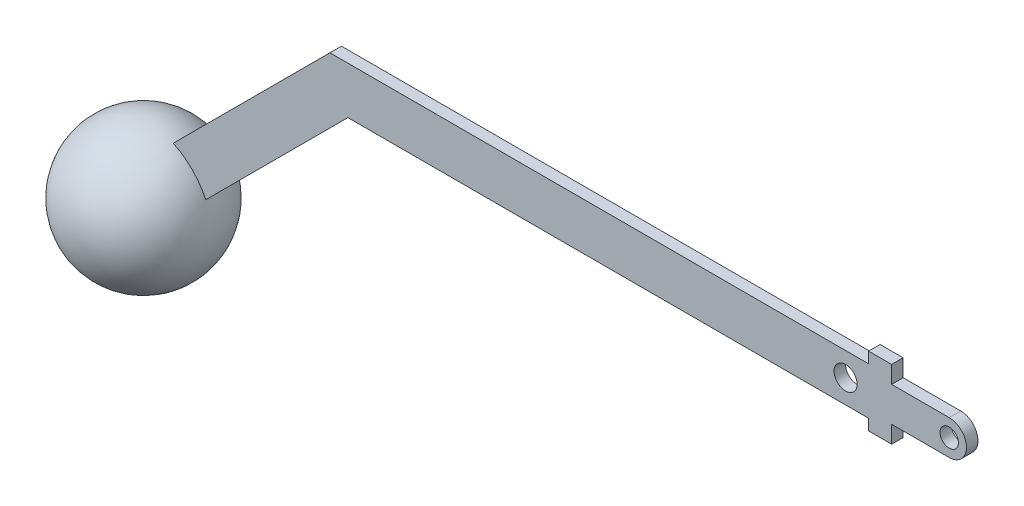
ISO-10303-21;
HEADER;
FILE_DESCRIPTION(('STEP AP214'),'2;1');
FILE_NAME('part.step','',(''),(''),'','','');
FILE_SCHEMA(('AUTOMOTIVE_DESIGN { 1 0 10303 214 1 1 1 1 }'));
ENDSEC;
DATA;
#1=APPLICATION_CONTEXT('core data for automotive mechanical design processes');
#2=APPLICATION_PROTOCOL_DEFINITION('international standard','automotive_design',2000,#1);
#3=PRODUCT_CONTEXT('',#1,'mechanical');
#4=PRODUCT('Part','Part','',(#3));
#5=PRODUCT_RELATED_PRODUCT_CATEGORY('part','',(#4));
#6=PRODUCT_DEFINITION_FORMATION('','',#4);
#7=PRODUCT_DEFINITION_CONTEXT('part definition',#1,'design');
#8=PRODUCT_DEFINITION('design','',#6,#7);
#9=PRODUCT_DEFINITION_SHAPE('','',#8);
#10=(LENGTH_UNIT() NAMED_UNIT(*) SI_UNIT(.MILLI.,.METRE.));
#11=(NAMED_UNIT(*) PLANE_ANGLE_UNIT() SI_UNIT($,.RADIAN.));
#12=(NAMED_UNIT(*) SI_UNIT($,.STERADIAN.) SOLID_ANGLE_UNIT());
#13=UNCERTAINTY_MEASURE_WITH_UNIT(LENGTH_MEASURE(1.E-05),#10,'distance_accuracy_value','');
#14=(GEOMETRIC_REPRESENTATION_CONTEXT(3) GLOBAL_UNCERTAINTY_ASSIGNED_CONTEXT((#13)) GLOBAL_UNIT_ASSIGNED_CONTEXT((#10,
#11,#12)) REPRESENTATION_CONTEXT('',''));
#15=CARTESIAN_POINT('',(0.,0.,0.));
#16=DIRECTION('',(0.,0.,1.));
#17=DIRECTION('',(1.,0.,0.));
#18=AXIS2_PLACEMENT_3D('',#15,#16,#17);
#19=CARTESIAN_POINT('',(-18.8288741067103,0.,0.));
#20=DIRECTION('',(1.,0.,0.));
#21=DIRECTION('',(0.,0.,-1.));
#22=AXIS2_PLACEMENT_3D('',#19,#20,#21);
#23=PLANE('',#22);
#24=DIRECTION('',(0.,0.,1.));
#25=VECTOR('',#24,1.);
#26=CARTESIAN_POINT('',(-18.8288741067103,7.5,4.99999999999999));
#27=LINE('',#26,#25);
#28=CARTESIAN_POINT('',(-18.8288741067103,7.5,0.));
#29=VERTEX_POINT('',#28);
#30=CARTESIAN_POINT('',(-18.8288741067103,7.5,4.99999999999999));
#31=VERTEX_POINT('',#30);
#32=EDGE_CURVE('E247',#29,#31,#27,.T.);
#33=ORIENTED_EDGE('',*,*,#32,.F.);
#34=DIRECTION('',(0.,1.,0.));
#35=VECTOR('',#34,1.);
#36=CARTESIAN_POINT('',(-18.8288741067103,15.,0.));
#37=LINE('',#36,#35);
#38=CARTESIAN_POINT('',(-18.8288741067103,15.,0.));
#39=VERTEX_POINT('',#38);
#40=EDGE_CURVE('E167',#29,#39,#37,.T.);
#41=ORIENTED_EDGE('',*,*,#40,.T.);
#42=DIRECTION('',(0.,0.,1.));
#43=VECTOR('',#42,1.);
#44=CARTESIAN_POINT('',(-18.8288741067103,15.,4.99999999999999));
#45=LINE('',#44,#43);
#46=CARTESIAN_POINT('',(-18.8288741067103,15.,4.99999999999999));
#47=VERTEX_POINT('',#46);
#48=EDGE_CURVE('E171',#39,#47,#45,.T.);
#49=ORIENTED_EDGE('',*,*,#48,.T.);
#50=DIRECTION('',(0.,-1.,0.));
#51=VECTOR('',#50,1.);
#52=CARTESIAN_POINT('',(-18.8288741067103,15.,4.99999999999999));
#53=LINE('',#52,#51);
#54=EDGE_CURVE('E162',#47,#31,#53,.T.);
#55=ORIENTED_EDGE('',*,*,#54,.T.);
#56=EDGE_LOOP('',(#33,#41,#49,#55));
#57=FACE_BOUND('',#56,.T.);
#58=ADVANCED_FACE('F35',(#57),#23,.T.);
#59=CARTESIAN_POINT('',(29.1954306267144,-10.2348441813063,5.));
#60=DIRECTION('',(0.,1.,0.));
#61=DIRECTION('',(0.,0.,1.));
#62=AXIS2_PLACEMENT_3D('',#59,#60,#61);
#63=PLANE('',#62);
#64=DIRECTION('',(1.,0.,0.));
#65=VECTOR('',#64,1.);
#66=CARTESIAN_POINT('',(29.1954306267144,-10.2348441813063,0.));
#67=LINE('',#66,#65);
#68=CARTESIAN_POINT('',(-254.897277930861,-10.2348441813064,0.));
#69=VERTEX_POINT('',#68);
#70=CARTESIAN_POINT('',(-28.8288741067103,-10.2348441813063,0.));
#71=VERTEX_POINT('',#70);
#72=EDGE_CURVE('E233',#69,#71,#67,.T.);
#73=ORIENTED_EDGE('',*,*,#72,.T.);
#74=DIRECTION('',(0.,0.,1.));
#75=VECTOR('',#74,1.);
#76=CARTESIAN_POINT('',(-28.8288741067103,-10.2348441813063,5.));
#77=LINE('',#76,#75);
#78=CARTESIAN_POINT('',(-28.8288741067103,-10.2348441813063,5.));
#79=VERTEX_POINT('',#78);
#80=EDGE_CURVE('E196',#71,#79,#77,.T.);
#81=ORIENTED_EDGE('',*,*,#80,.T.);
#82=DIRECTION('',(1.,0.,0.));
#83=VECTOR('',#82,1.);
#84=CARTESIAN_POINT('',(-260.804569373286,-10.2348441813063,5.));
#85=LINE('',#84,#83);
#86=CARTESIAN_POINT('',(-254.897277930861,-10.2348441813063,5.));
#87=VERTEX_POINT('',#86);
#88=EDGE_CURVE('E229',#87,#79,#85,.T.);
#89=ORIENTED_EDGE('',*,*,#88,.F.);
#90=DIRECTION('',(0.,0.,1.));
#91=VECTOR('',#90,1.);
#92=CARTESIAN_POINT('',(-254.897277930861,-10.2348441813063,-140.071478045431));
#93=LINE('',#92,#91);
#94=EDGE_CURVE('E219',#69,#87,#93,.T.);
#95=ORIENTED_EDGE('',*,*,#94,.F.);
#96=EDGE_LOOP('',(#73,#81,#89,#95));
#97=FACE_BOUND('',#96,.T.);
#98=ADVANCED_FACE('F37',(#97),#63,.F.);
#99=CARTESIAN_POINT('',(-52.6472735149724,10.2348441813063,5.));
#100=DIRECTION('',(0.,-1.,0.));
#101=DIRECTION('',(1.,0.,0.));
#102=AXIS2_PLACEMENT_3D('',#99,#100,#101);
#103=PLANE('',#102);
#104=DIRECTION('',(-1.,0.,0.));
#105=VECTOR('',#104,1.);
#106=CARTESIAN_POINT('',(-138.115348744524,10.2348441813063,5.));
#107=LINE('',#106,#105);
#108=CARTESIAN_POINT('',(-28.8288741067103,10.2348441813063,4.99999999999999));
#109=VERTEX_POINT('',#108);
#110=CARTESIAN_POINT('',(-262.71186081571,10.2348441813063,5.));
#111=VERTEX_POINT('',#110);
#112=EDGE_CURVE('E227',#109,#111,#107,.T.);
#113=ORIENTED_EDGE('',*,*,#112,.F.);
#114=DIRECTION('',(0.,0.,1.));
#115=VECTOR('',#114,1.);
#116=CARTESIAN_POINT('',(-28.8288741067103,10.2348441813063,-44.5));
#117=LINE('',#116,#115);
#118=CARTESIAN_POINT('',(-28.8288741067103,10.2348441813063,0.));
#119=VERTEX_POINT('',#118);
#120=EDGE_CURVE('E194',#119,#109,#117,.T.);
#121=ORIENTED_EDGE('',*,*,#120,.F.);
#122=DIRECTION('',(-1.,0.,0.));
#123=VECTOR('',#122,1.);
#124=CARTESIAN_POINT('',(-52.6472735149724,10.2348441813063,0.));
#125=LINE('',#124,#123);
#126=CARTESIAN_POINT('',(-262.71186081571,10.2348441813063,0.));
#127=VERTEX_POINT('',#126);
#128=EDGE_CURVE('E230',#119,#127,#125,.T.);
#129=ORIENTED_EDGE('',*,*,#128,.T.);
#130=DIRECTION('',(0.,0.,1.));
#131=VECTOR('',#130,1.);
#132=CARTESIAN_POINT('',(-262.71186081571,10.2348441813063,-140.071478045431));
#133=LINE('',#132,#131);
#134=EDGE_CURVE('E212',#127,#111,#133,.T.);
#135=ORIENTED_EDGE('',*,*,#134,.T.);
#136=EDGE_LOOP('',(#113,#121,#129,#135));
#137=FACE_BOUND('',#136,.T.);
#138=ADVANCED_FACE('F281',(#137),#103,.F.);
#139=CARTESIAN_POINT('',(29.1954306267144,0.,5.));
#140=DIRECTION('',(0.,0.,1.));
#141=DIRECTION('',(1.,0.,0.));
#142=AXIS2_PLACEMENT_3D('',#139,#140,#141);
#143=PLANE('',#142);
#144=CARTESIAN_POINT('',(6.17112589328973,0.,5.));
#145=DIRECTION('',(0.,0.,-1.));
#146=DIRECTION('',(1.,0.,0.));
#147=AXIS2_PLACEMENT_3D('',#144,#145,#146);
#148=CIRCLE('',#147,7.5);
#149=CARTESIAN_POINT('',(6.17112589328973,7.5,5.));
#150=VERTEX_POINT('',#149);
#151=CARTESIAN_POINT('',(6.17112589328973,-7.5,5.));
#152=VERTEX_POINT('',#151);
#153=EDGE_CURVE('E134',#150,#152,#148,.T.);
#154=ORIENTED_EDGE('',*,*,#153,.F.);
#155=DIRECTION('',(-1.,0.,0.));
#156=VECTOR('',#155,1.);
#157=CARTESIAN_POINT('',(41.1711258932897,7.5,4.99999999999999));
#158=LINE('',#157,#156);
#159=EDGE_CURVE('E256',#150,#31,#158,.T.);
#160=ORIENTED_EDGE('',*,*,#159,.T.);
#161=ORIENTED_EDGE('',*,*,#54,.F.);
#162=DIRECTION('',(-1.,0.,0.));
#163=VECTOR('',#162,1.);
#164=CARTESIAN_POINT('',(-18.8288741067103,15.,4.99999999999999));
#165=LINE('',#164,#163);
#166=CARTESIAN_POINT('',(-28.8288741067103,15.,4.99999999999999));
#167=VERTEX_POINT('',#166);
#168=EDGE_CURVE('E172',#47,#167,#165,.T.);
#169=ORIENTED_EDGE('',*,*,#168,.T.);
#170=DIRECTION('',(0.,-1.,0.));
#171=VECTOR('',#170,1.);
#172=CARTESIAN_POINT('',(-28.8288741067103,15.,4.99999999999999));
#173=LINE('',#172,#171);
#174=EDGE_CURVE('E157',#167,#109,#173,.T.);
#175=ORIENTED_EDGE('',*,*,#174,.T.);
#176=ORIENTED_EDGE('',*,*,#112,.T.);
#177=DIRECTION('',(-0.707106781186551,-0.707106781186544,0.));
#178=VECTOR('',#177,1.);
#179=CARTESIAN_POINT('',(-350.728450927537,-77.7817459305198,5.));
#180=LINE('',#179,#178);
#181=CARTESIAN_POINT('',(-330.728450927537,-57.7817459305198,5.));
#182=VERTEX_POINT('',#181);
#183=EDGE_CURVE('E216',#111,#182,#180,.T.);
#184=ORIENTED_EDGE('',*,*,#183,.T.);
#185=CARTESIAN_POINT('',(-343.657383115672,-84.8528137423853,5.));
#186=DIRECTION('',(0.,0.,1.));
#187=DIRECTION('',(1.,0.,0.));
#188=AXIS2_PLACEMENT_3D('',#185,#186,#187);
#189=CIRCLE('',#188,30.);
#190=CARTESIAN_POINT('',(-316.586315303806,-71.9238815542509,5.));
#191=VERTEX_POINT('',#190);
#192=EDGE_CURVE('E201',#182,#191,#189,.F.);
#193=ORIENTED_EDGE('',*,*,#192,.T.);
#194=DIRECTION('',(0.707106781186551,0.707106781186544,0.));
#195=VECTOR('',#194,1.);
#196=CARTESIAN_POINT('',(-336.586315303806,-91.9238815542507,5.));
#197=LINE('',#196,#195);
#198=EDGE_CURVE('E207',#191,#87,#197,.T.);
#199=ORIENTED_EDGE('',*,*,#198,.T.);
#200=ORIENTED_EDGE('',*,*,#88,.T.);
#201=CARTESIAN_POINT('',(-28.8288741067103,-15.,4.99999999999999));
#202=VERTEX_POINT('',#201);
#203=EDGE_CURVE('E155',#79,#202,#173,.T.);
#204=ORIENTED_EDGE('',*,*,#203,.T.);
#205=DIRECTION('',(-1.,0.,0.));
#206=VECTOR('',#205,1.);
#207=CARTESIAN_POINT('',(-18.8288741067103,-15.,4.99999999999999));
#208=LINE('',#207,#206);
#209=CARTESIAN_POINT('',(-18.8288741067103,-15.,4.99999999999999));
#210=VERTEX_POINT('',#209);
#211=EDGE_CURVE('E191',#210,#202,#208,.T.);
#212=ORIENTED_EDGE('',*,*,#211,.F.);
#213=CARTESIAN_POINT('',(-18.8288741067103,-7.5,4.99999999999999));
#214=VERTEX_POINT('',#213);
#215=EDGE_CURVE('E154',#214,#210,#53,.T.);
#216=ORIENTED_EDGE('',*,*,#215,.F.);
#217=DIRECTION('',(-1.,0.,0.));
#218=VECTOR('',#217,1.);
#219=CARTESIAN_POINT('',(41.1711258932897,-7.5,4.99999999999998));
#220=LINE('',#219,#218);
#221=EDGE_CURVE('E146',#152,#214,#220,.T.);
#222=ORIENTED_EDGE('',*,*,#221,.F.);
#223=EDGE_LOOP('',(#154,#160,#161,#169,#175,#176,#184,#193,#199,#200,#204,#212,#216,#222));
#224=FACE_BOUND('',#223,.T.);
#225=CARTESIAN_POINT('',(6.17112589328973,0.,5.));
#226=DIRECTION('',(0.,0.,1.));
#227=DIRECTION('',(1.,0.,0.));
#228=AXIS2_PLACEMENT_3D('',#225,#226,#227);
#229=CIRCLE('',#228,4.);
#230=CARTESIAN_POINT('',(10.1711258932897,0.,5.));
#231=VERTEX_POINT('',#230);
#232=EDGE_CURVE('E244',#231,#231,#229,.T.);
#233=ORIENTED_EDGE('',*,*,#232,.F.);
#234=EDGE_LOOP('',(#233));
#235=FACE_BOUND('',#234,.T.);
#236=CARTESIAN_POINT('',(-38.8288741067103,0.,5.));
#237=DIRECTION('',(0.,0.,1.));
#238=DIRECTION('',(1.,0.,0.));
#239=AXIS2_PLACEMENT_3D('',#236,#237,#238);
#240=CIRCLE('',#239,5.);
#241=CARTESIAN_POINT('',(-33.8288741067103,0.,5.));
#242=VERTEX_POINT('',#241);
#243=EDGE_CURVE('E214',#242,#242,#240,.T.);
#244=ORIENTED_EDGE('',*,*,#243,.F.);
#245=EDGE_LOOP('',(#244));
#246=FACE_BOUND('',#245,.T.);
#247=ADVANCED_FACE('F151',(#224,#235,#246),#143,.T.);
#248=CARTESIAN_POINT('',(29.1954306267144,0.,0.));
#249=DIRECTION('',(0.,0.,1.));
#250=DIRECTION('',(1.,0.,0.));
#251=AXIS2_PLACEMENT_3D('',#248,#249,#250);
#252=PLANE('',#251);
#253=CARTESIAN_POINT('',(6.17112589328973,0.,0.));
#254=DIRECTION('',(0.,0.,1.));
#255=DIRECTION('',(1.,0.,0.));
#256=AXIS2_PLACEMENT_3D('',#253,#254,#255);
#257=CIRCLE('',#256,4.);
#258=CARTESIAN_POINT('',(10.1711258932897,0.,0.));
#259=VERTEX_POINT('',#258);
#260=EDGE_CURVE('E241',#259,#259,#257,.T.);
#261=ORIENTED_EDGE('',*,*,#260,.T.);
#262=EDGE_LOOP('',(#261));
#263=FACE_BOUND('',#262,.T.);
#264=DIRECTION('',(-1.,0.,0.));
#265=VECTOR('',#264,1.);
#266=CARTESIAN_POINT('',(41.1711258932897,7.5,0.));
#267=LINE('',#266,#265);
#268=CARTESIAN_POINT('',(6.17112589328973,7.5,0.));
#269=VERTEX_POINT('',#268);
#270=EDGE_CURVE('E56',#269,#29,#267,.T.);
#271=ORIENTED_EDGE('',*,*,#270,.F.);
#272=CARTESIAN_POINT('',(6.17112589328973,0.,0.));
#273=DIRECTION('',(0.,0.,1.));
#274=DIRECTION('',(1.,0.,0.));
#275=AXIS2_PLACEMENT_3D('',#272,#273,#274);
#276=CIRCLE('',#275,7.5);
#277=CARTESIAN_POINT('',(6.17112589328973,-7.5,0.));
#278=VERTEX_POINT('',#277);
#279=EDGE_CURVE('E50',#269,#278,#276,.F.);
#280=ORIENTED_EDGE('',*,*,#279,.T.);
#281=DIRECTION('',(-1.,0.,0.));
#282=VECTOR('',#281,1.);
#283=CARTESIAN_POINT('',(41.1711258932897,-7.5,0.));
#284=LINE('',#283,#282);
#285=CARTESIAN_POINT('',(-18.8288741067103,-7.5,0.));
#286=VERTEX_POINT('',#285);
#287=EDGE_CURVE('E148',#278,#286,#284,.T.);
#288=ORIENTED_EDGE('',*,*,#287,.T.);
#289=CARTESIAN_POINT('',(-18.8288741067103,-15.,0.));
#290=VERTEX_POINT('',#289);
#291=EDGE_CURVE('E168',#290,#286,#37,.T.);
#292=ORIENTED_EDGE('',*,*,#291,.F.);
#293=DIRECTION('',(-1.,0.,0.));
#294=VECTOR('',#293,1.);
#295=CARTESIAN_POINT('',(-18.8288741067103,-15.,0.));
#296=LINE('',#295,#294);
#297=CARTESIAN_POINT('',(-28.8288741067103,-15.,0.));
#298=VERTEX_POINT('',#297);
#299=EDGE_CURVE('E188',#290,#298,#296,.T.);
#300=ORIENTED_EDGE('',*,*,#299,.T.);
#301=DIRECTION('',(0.,1.,0.));
#302=VECTOR('',#301,1.);
#303=CARTESIAN_POINT('',(-28.8288741067103,15.,0.));
#304=LINE('',#303,#302);
#305=EDGE_CURVE('E178',#298,#71,#304,.T.);
#306=ORIENTED_EDGE('',*,*,#305,.T.);
#307=ORIENTED_EDGE('',*,*,#72,.F.);
#308=DIRECTION('',(-0.707106781186551,-0.707106781186544,0.));
#309=VECTOR('',#308,1.);
#310=CARTESIAN_POINT('',(-336.586315303806,-91.9238815542507,0.));
#311=LINE('',#310,#309);
#312=CARTESIAN_POINT('',(-316.901295618777,-72.2388618692214,0.));
#313=VERTEX_POINT('',#312);
#314=EDGE_CURVE('E208',#69,#313,#311,.T.);
#315=ORIENTED_EDGE('',*,*,#314,.T.);
#316=CARTESIAN_POINT('',(-343.657383115672,-84.8528137423853,0.));
#317=DIRECTION('',(0.,0.,1.));
#318=DIRECTION('',(1.,0.,0.));
#319=AXIS2_PLACEMENT_3D('',#316,#317,#318);
#320=CIRCLE('',#319,29.5803989154981);
#321=CARTESIAN_POINT('',(-331.043431242507,-58.0967262454903,0.));
#322=VERTEX_POINT('',#321);
#323=EDGE_CURVE('E199',#322,#313,#320,.F.);
#324=ORIENTED_EDGE('',*,*,#323,.F.);
#325=DIRECTION('',(0.707106781186551,0.707106781186544,0.));
#326=VECTOR('',#325,1.);
#327=CARTESIAN_POINT('',(-350.728450927537,-77.7817459305198,0.));
#328=LINE('',#327,#326);
#329=EDGE_CURVE('E211',#322,#127,#328,.T.);
#330=ORIENTED_EDGE('',*,*,#329,.T.);
#331=ORIENTED_EDGE('',*,*,#128,.F.);
#332=CARTESIAN_POINT('',(-28.8288741067103,15.,0.));
#333=VERTEX_POINT('',#332);
#334=EDGE_CURVE('E177',#119,#333,#304,.T.);
#335=ORIENTED_EDGE('',*,*,#334,.T.);
#336=DIRECTION('',(-1.,0.,0.));
#337=VECTOR('',#336,1.);
#338=CARTESIAN_POINT('',(-18.8288741067103,15.,0.));
#339=LINE('',#338,#337);
#340=EDGE_CURVE('E185',#39,#333,#339,.T.);
#341=ORIENTED_EDGE('',*,*,#340,.F.);
#342=ORIENTED_EDGE('',*,*,#40,.F.);
#343=EDGE_LOOP('',(#271,#280,#288,#292,#300,#306,#307,#315,#324,#330,#331,#335,#341,#342));
#344=FACE_BOUND('',#343,.T.);
#345=CARTESIAN_POINT('',(-38.8288741067103,0.,0.));
#346=DIRECTION('',(0.,0.,1.));
#347=DIRECTION('',(1.,0.,0.));
#348=AXIS2_PLACEMENT_3D('',#345,#346,#347);
#349=CIRCLE('',#348,5.);
#350=CARTESIAN_POINT('',(-33.8288741067103,0.,0.));
#351=VERTEX_POINT('',#350);
#352=EDGE_CURVE('E226',#351,#351,#349,.T.);
#353=ORIENTED_EDGE('',*,*,#352,.T.);
#354=EDGE_LOOP('',(#353));
#355=FACE_BOUND('',#354,.T.);
#356=ADVANCED_FACE('F300',(#263,#344,#355),#252,.F.);
#357=CARTESIAN_POINT('',(-38.8288741067103,0.,-17.5));
#358=DIRECTION('',(0.,0.,1.));
#359=DIRECTION('',(1.,0.,0.));
#360=AXIS2_PLACEMENT_3D('',#357,#358,#359);
#361=CYLINDRICAL_SURFACE('',#360,5.);
#362=CARTESIAN_POINT('',(-33.8288741067103,0.,5.));
#363=CARTESIAN_POINT('',(-33.8288741067103,0.,4.94791666666667));
#364=CARTESIAN_POINT('',(-33.8288741067103,0.,4.89583333333333));
#365=CARTESIAN_POINT('',(-33.8288741067103,0.,4.79166666666667));
#366=CARTESIAN_POINT('',(-33.8288741067103,0.,4.73958333333333));
#367=CARTESIAN_POINT('',(-33.8288741067103,0.,4.63541666666667));
#368=CARTESIAN_POINT('',(-33.8288741067103,0.,4.58333333333333));
#369=CARTESIAN_POINT('',(-33.8288741067103,0.,4.47916666666667));
#370=CARTESIAN_POINT('',(-33.8288741067103,0.,4.42708333333333));
#371=CARTESIAN_POINT('',(-33.8288741067103,0.,4.32291666666667));
#372=CARTESIAN_POINT('',(-33.8288741067103,0.,4.27083333333333));
#373=CARTESIAN_POINT('',(-33.8288741067103,0.,4.16666666666667));
#374=CARTESIAN_POINT('',(-33.8288741067103,0.,4.11458333333333));
#375=CARTESIAN_POINT('',(-33.8288741067103,0.,4.01041666666667));
#376=CARTESIAN_POINT('',(-33.8288741067103,0.,3.95833333333333));
#377=CARTESIAN_POINT('',(-33.8288741067103,0.,3.85416666666667));
#378=CARTESIAN_POINT('',(-33.8288741067103,0.,3.80208333333333));
#379=CARTESIAN_POINT('',(-33.8288741067103,0.,3.69791666666667));
#380=CARTESIAN_POINT('',(-33.8288741067103,0.,3.64583333333333));
#381=CARTESIAN_POINT('',(-33.8288741067103,0.,3.54166666666667));
#382=CARTESIAN_POINT('',(-33.8288741067103,0.,3.48958333333333));
#383=CARTESIAN_POINT('',(-33.8288741067103,0.,3.38541666666667));
#384=CARTESIAN_POINT('',(-33.8288741067103,0.,3.33333333333333));
#385=CARTESIAN_POINT('',(-33.8288741067103,0.,3.22916666666667));
#386=CARTESIAN_POINT('',(-33.8288741067103,0.,3.17708333333333));
#387=CARTESIAN_POINT('',(-33.8288741067103,0.,3.07291666666667));
#388=CARTESIAN_POINT('',(-33.8288741067103,0.,3.02083333333333));
#389=CARTESIAN_POINT('',(-33.8288741067103,0.,2.91666666666667));
#390=CARTESIAN_POINT('',(-33.8288741067103,0.,2.86458333333333));
#391=CARTESIAN_POINT('',(-33.8288741067103,0.,2.76041666666667));
#392=CARTESIAN_POINT('',(-33.8288741067103,0.,2.70833333333333));
#393=CARTESIAN_POINT('',(-33.8288741067103,0.,2.60416666666667));
#394=CARTESIAN_POINT('',(-33.8288741067103,0.,2.55208333333333));
#395=CARTESIAN_POINT('',(-33.8288741067103,0.,2.44791666666667));
#396=CARTESIAN_POINT('',(-33.8288741067103,0.,2.39583333333333));
#397=CARTESIAN_POINT('',(-33.8288741067103,0.,2.29166666666667));
#398=CARTESIAN_POINT('',(-33.8288741067103,0.,2.23958333333333));
#399=CARTESIAN_POINT('',(-33.8288741067103,0.,2.13541666666667));
#400=CARTESIAN_POINT('',(-33.8288741067103,0.,2.08333333333333));
#401=CARTESIAN_POINT('',(-33.8288741067103,0.,1.97916666666667));
#402=CARTESIAN_POINT('',(-33.8288741067103,0.,1.92708333333333));
#403=CARTESIAN_POINT('',(-33.8288741067103,0.,1.82291666666666));
#404=CARTESIAN_POINT('',(-33.8288741067103,0.,1.77083333333333));
#405=CARTESIAN_POINT('',(-33.8288741067103,0.,1.66666666666666));
#406=CARTESIAN_POINT('',(-33.8288741067103,0.,1.61458333333333));
#407=CARTESIAN_POINT('',(-33.8288741067103,0.,1.51041666666666));
#408=CARTESIAN_POINT('',(-33.8288741067103,0.,1.45833333333333));
#409=CARTESIAN_POINT('',(-33.8288741067103,0.,1.35416666666666));
#410=CARTESIAN_POINT('',(-33.8288741067103,0.,1.30208333333333));
#411=CARTESIAN_POINT('',(-33.8288741067103,0.,1.19791666666666));
#412=CARTESIAN_POINT('',(-33.8288741067103,0.,1.14583333333333));
#413=CARTESIAN_POINT('',(-33.8288741067103,0.,1.04166666666666));
#414=CARTESIAN_POINT('',(-33.8288741067103,0.,0.989583333333331));
#415=CARTESIAN_POINT('',(-33.8288741067103,0.,0.885416666666664));
#416=CARTESIAN_POINT('',(-33.8288741067103,0.,0.833333333333331));
#417=CARTESIAN_POINT('',(-33.8288741067103,0.,0.729166666666664));
#418=CARTESIAN_POINT('',(-33.8288741067103,0.,0.67708333333333));
#419=CARTESIAN_POINT('',(-33.8288741067103,0.,0.572916666666664));
#420=CARTESIAN_POINT('',(-33.8288741067103,0.,0.52083333333333));
#421=CARTESIAN_POINT('',(-33.8288741067103,0.,0.416666666666664));
#422=CARTESIAN_POINT('',(-33.8288741067103,0.,0.36458333333333));
#423=CARTESIAN_POINT('',(-33.8288741067103,0.,0.260416666666663));
#424=CARTESIAN_POINT('',(-33.8288741067103,0.,0.20833333333333));
#425=CARTESIAN_POINT('',(-33.8288741067103,0.,0.104166666666663));
#426=CARTESIAN_POINT('',(-33.8288741067103,0.,0.05208333333333));
#427=CARTESIAN_POINT('',(-33.8288741067103,0.,0.));
#428=B_SPLINE_CURVE_WITH_KNOTS('',3,(#362,#363,#364,#365,#366,#367,#368,#369,#370,#371,#372,
#373,#374,#375,#376,#377,#378,#379,#380,#381,#382,#383,#384,#385,#386,#387,#388,#389,#390,#391,
#392,#393,#394,#395,#396,#397,#398,#399,#400,#401,#402,#403,#404,#405,#406,#407,#408,#409,#410,
#411,#412,#413,#414,#415,#416,#417,#418,#419,#420,#421,#422,#423,#424,#425,#426,#427),
.UNSPECIFIED.,.F.,.F.,(4,2,2,2,2,2,2,2,2,2,2,2,2,2,2,2,2,2,2,2,2,2,2,2,2,2,2,2,2,2,2,2,4),(0.,
0.15625,0.3125,0.46875,0.625000000000001,0.781250000000001,0.937500000000001,1.09375,1.25,
1.40625,1.5625,1.71875,1.875,2.03125,2.1875,2.34375,2.5,2.65625,2.8125,2.96875,3.125,3.28125,
3.4375,3.59375,3.75,3.90625,4.0625,4.21875,4.375,4.53125,4.6875,4.84375,5.),.UNSPECIFIED.);
#429=EDGE_CURVE('BSEAM336',#242,#351,#428,.T.);
#430=ORIENTED_EDGE('',*,*,#243,.T.);
#431=ORIENTED_EDGE('',*,*,#352,.F.);
#432=ORIENTED_EDGE('',*,*,#429,.T.);
#433=ORIENTED_EDGE('',*,*,#429,.F.);
#434=EDGE_LOOP('',(#430,#432,#431,#433));
#435=FACE_BOUND('',#434,.T.);
#436=ADVANCED_FACE('F336',(#435),#361,.F.);
#437=CARTESIAN_POINT('',(-350.728450927537,-77.7817459305198,-140.071478045431));
#438=DIRECTION('',(-0.707106781186544,0.707106781186551,0.));
#439=DIRECTION('',(-0.707106781186551,-0.707106781186544,0.));
#440=AXIS2_PLACEMENT_3D('',#437,#438,#439);
#441=PLANE('',#440);
#442=ORIENTED_EDGE('',*,*,#329,.F.);
#443=CARTESIAN_POINT('',(-350.728450927537,-77.7817459305197,5.));
#444=DIRECTION('',(-0.707106781186544,0.707106781186551,0.));
#445=DIRECTION('',(-0.707106781186551,-0.707106781186544,0.));
#446=AXIS2_PLACEMENT_3D('',#443,#444,#445);
#447=CIRCLE('',#446,28.2842712474619);
#448=EDGE_CURVE('E204',#322,#182,#447,.F.);
#449=ORIENTED_EDGE('',*,*,#448,.T.);
#450=ORIENTED_EDGE('',*,*,#183,.F.);
#451=ORIENTED_EDGE('',*,*,#134,.F.);
#452=EDGE_LOOP('',(#442,#449,#450,#451));
#453=FACE_BOUND('',#452,.T.);
#454=ADVANCED_FACE('F315',(#453),#441,.T.);
#455=CARTESIAN_POINT('',(-336.586315303806,-91.9238815542507,-140.071478045431));
#456=DIRECTION('',(0.707106781186544,-0.707106781186551,0.));
#457=DIRECTION('',(0.707106781186551,0.707106781186544,0.));
#458=AXIS2_PLACEMENT_3D('',#455,#456,#457);
#459=PLANE('',#458);
#460=ORIENTED_EDGE('',*,*,#198,.F.);
#461=CARTESIAN_POINT('',(-336.586315303806,-91.9238815542508,5.));
#462=DIRECTION('',(0.707106781186544,-0.707106781186551,0.));
#463=DIRECTION('',(0.707106781186551,0.707106781186544,0.));
#464=AXIS2_PLACEMENT_3D('',#461,#462,#463);
#465=CIRCLE('',#464,28.2842712474619);
#466=EDGE_CURVE('E43',#191,#313,#465,.F.);
#467=ORIENTED_EDGE('',*,*,#466,.T.);
#468=ORIENTED_EDGE('',*,*,#314,.F.);
#469=ORIENTED_EDGE('',*,*,#94,.T.);
#470=EDGE_LOOP('',(#460,#467,#468,#469));
#471=FACE_BOUND('',#470,.T.);
#472=ADVANCED_FACE('F320',(#471),#459,.T.);
#473=CARTESIAN_POINT('',(-343.657383115672,-84.8528137423853,5.));
#474=DIRECTION('',(-1.,0.,0.));
#475=DIRECTION('',(0.,1.,0.));
#476=AXIS2_PLACEMENT_3D('',#473,#474,#475);
#477=SPHERICAL_SURFACE('',#476,30.);
#478=ORIENTED_EDGE('',*,*,#448,.F.);
#479=ORIENTED_EDGE('',*,*,#323,.T.);
#480=ORIENTED_EDGE('',*,*,#466,.F.);
#481=ORIENTED_EDGE('',*,*,#192,.F.);
#482=EDGE_LOOP('',(#478,#479,#480,#481));
#483=FACE_BOUND('',#482,.T.);
#484=ADVANCED_FACE('F331',(#483),#477,.T.);
#485=CARTESIAN_POINT('',(-28.8288741067103,0.,0.));
#486=DIRECTION('',(1.,0.,0.));
#487=DIRECTION('',(0.,0.,-1.));
#488=AXIS2_PLACEMENT_3D('',#485,#486,#487);
#489=PLANE('',#488);
#490=ORIENTED_EDGE('',*,*,#334,.F.);
#491=ORIENTED_EDGE('',*,*,#120,.T.);
#492=ORIENTED_EDGE('',*,*,#174,.F.);
#493=DIRECTION('',(0.,0.,1.));
#494=VECTOR('',#493,1.);
#495=CARTESIAN_POINT('',(-28.8288741067103,15.,4.99999999999999));
#496=LINE('',#495,#494);
#497=EDGE_CURVE('E181',#333,#167,#496,.T.);
#498=ORIENTED_EDGE('',*,*,#497,.F.);
#499=EDGE_LOOP('',(#490,#491,#492,#498));
#500=FACE_BOUND('',#499,.T.);
#501=ADVANCED_FACE('F292',(#500),#489,.F.);
#502=CARTESIAN_POINT('',(-18.8288741067103,-15.,4.99999999999999));
#503=DIRECTION('',(0.,1.,0.));
#504=DIRECTION('',(0.,0.,1.));
#505=AXIS2_PLACEMENT_3D('',#502,#503,#504);
#506=PLANE('',#505);
#507=DIRECTION('',(0.,0.,-1.));
#508=VECTOR('',#507,1.);
#509=CARTESIAN_POINT('',(-28.8288741067103,-15.,4.99999999999999));
#510=LINE('',#509,#508);
#511=EDGE_CURVE('E175',#202,#298,#510,.T.);
#512=ORIENTED_EDGE('',*,*,#511,.T.);
#513=ORIENTED_EDGE('',*,*,#299,.F.);
#514=DIRECTION('',(0.,0.,-1.));
#515=VECTOR('',#514,1.);
#516=CARTESIAN_POINT('',(-18.8288741067103,-15.,4.99999999999999));
#517=LINE('',#516,#515);
#518=EDGE_CURVE('E165',#210,#290,#517,.T.);
#519=ORIENTED_EDGE('',*,*,#518,.F.);
#520=ORIENTED_EDGE('',*,*,#211,.T.);
#521=EDGE_LOOP('',(#512,#513,#519,#520));
#522=FACE_BOUND('',#521,.T.);
#523=ADVANCED_FACE('F293',(#522),#506,.F.);
#524=CARTESIAN_POINT('',(-18.8288741067103,15.,4.99999999999999));
#525=DIRECTION('',(0.,-1.,0.));
#526=DIRECTION('',(0.,0.,-1.));
#527=AXIS2_PLACEMENT_3D('',#524,#525,#526);
#528=PLANE('',#527);
#529=ORIENTED_EDGE('',*,*,#497,.T.);
#530=ORIENTED_EDGE('',*,*,#168,.F.);
#531=ORIENTED_EDGE('',*,*,#48,.F.);
#532=ORIENTED_EDGE('',*,*,#340,.T.);
#533=EDGE_LOOP('',(#529,#530,#531,#532));
#534=FACE_BOUND('',#533,.T.);
#535=ADVANCED_FACE('F285',(#534),#528,.F.);
#536=DIRECTION('',(0.,0.,-1.));
#537=VECTOR('',#536,1.);
#538=CARTESIAN_POINT('',(-18.8288741067103,-7.5,4.99999999999998));
#539=LINE('',#538,#537);
#540=EDGE_CURVE('E243',#214,#286,#539,.T.);
#541=ORIENTED_EDGE('',*,*,#540,.F.);
#542=ORIENTED_EDGE('',*,*,#215,.T.);
#543=ORIENTED_EDGE('',*,*,#518,.T.);
#544=ORIENTED_EDGE('',*,*,#291,.T.);
#545=EDGE_LOOP('',(#541,#542,#543,#544));
#546=FACE_BOUND('',#545,.T.);
#547=ADVANCED_FACE('F275',(#546),#23,.T.);
#548=ORIENTED_EDGE('',*,*,#80,.F.);
#549=ORIENTED_EDGE('',*,*,#305,.F.);
#550=ORIENTED_EDGE('',*,*,#511,.F.);
#551=ORIENTED_EDGE('',*,*,#203,.F.);
#552=EDGE_LOOP('',(#548,#549,#550,#551));
#553=FACE_BOUND('',#552,.T.);
#554=ADVANCED_FACE('F271',(#553),#489,.F.);
#555=CARTESIAN_POINT('',(41.1711258932897,-7.5,4.99999999999998));
#556=DIRECTION('',(0.,1.,0.));
#557=DIRECTION('',(0.,0.,1.));
#558=AXIS2_PLACEMENT_3D('',#555,#556,#557);
#559=PLANE('',#558);
#560=ORIENTED_EDGE('',*,*,#287,.F.);
#561=DIRECTION('',(0.,0.,1.));
#562=VECTOR('',#561,1.);
#563=CARTESIAN_POINT('',(6.17112589328973,-7.5,-55.));
#564=LINE('',#563,#562);
#565=EDGE_CURVE('E137',#278,#152,#564,.T.);
#566=ORIENTED_EDGE('',*,*,#565,.T.);
#567=ORIENTED_EDGE('',*,*,#221,.T.);
#568=ORIENTED_EDGE('',*,*,#540,.T.);
#569=EDGE_LOOP('',(#560,#566,#567,#568));
#570=FACE_BOUND('',#569,.T.);
#571=ADVANCED_FACE('F144',(#570),#559,.F.);
#572=CARTESIAN_POINT('',(41.1711258932897,7.5,4.99999999999999));
#573=DIRECTION('',(0.,-1.,0.));
#574=DIRECTION('',(0.,0.,-1.));
#575=AXIS2_PLACEMENT_3D('',#572,#573,#574);
#576=PLANE('',#575);
#577=ORIENTED_EDGE('',*,*,#159,.F.);
#578=DIRECTION('',(0.,0.,-1.));
#579=VECTOR('',#578,1.);
#580=CARTESIAN_POINT('',(6.17112589328973,7.5,4.99999999999999));
#581=LINE('',#580,#579);
#582=EDGE_CURVE('E11',#150,#269,#581,.T.);
#583=ORIENTED_EDGE('',*,*,#582,.T.);
#584=ORIENTED_EDGE('',*,*,#270,.T.);
#585=ORIENTED_EDGE('',*,*,#32,.T.);
#586=EDGE_LOOP('',(#577,#583,#584,#585));
#587=FACE_BOUND('',#586,.T.);
#588=ADVANCED_FACE('F262',(#587),#576,.F.);
#589=CARTESIAN_POINT('',(6.17112589328973,0.,-25.));
#590=DIRECTION('',(0.,0.,1.));
#591=DIRECTION('',(1.,0.,0.));
#592=AXIS2_PLACEMENT_3D('',#589,#590,#591);
#593=CYLINDRICAL_SURFACE('',#592,4.);
#594=ORIENTED_EDGE('',*,*,#232,.T.);
#595=EDGE_LOOP('',(#594));
#596=FACE_BOUND('',#595,.T.);
#597=ORIENTED_EDGE('',*,*,#260,.F.);
#598=EDGE_LOOP('',(#597));
#599=FACE_BOUND('',#598,.T.);
#600=ADVANCED_FACE('F264',(#596,#599),#593,.F.);
#601=CARTESIAN_POINT('',(6.17112589328973,0.,-55.));
#602=DIRECTION('',(0.,0.,1.));
#603=DIRECTION('',(1.,0.,0.));
#604=AXIS2_PLACEMENT_3D('',#601,#602,#603);
#605=CYLINDRICAL_SURFACE('',#604,7.5);
#606=ORIENTED_EDGE('',*,*,#582,.F.);
#607=ORIENTED_EDGE('',*,*,#153,.T.);
#608=ORIENTED_EDGE('',*,*,#565,.F.);
#609=ORIENTED_EDGE('',*,*,#279,.F.);
#610=EDGE_LOOP('',(#606,#607,#608,#609));
#611=FACE_BOUND('',#610,.T.);
#612=ADVANCED_FACE('F136',(#611),#605,.T.);
#613=CLOSED_SHELL('',(#58,#98,#138,#247,#356,#436,#454,#472,#484,#501,#523,#535,#547,#554,#571,
#588,#600,#612));
#614=MANIFOLD_SOLID_BREP('B2',#613);
#615=ADVANCED_BREP_SHAPE_REPRESENTATION('',(#18,#614),#14);
#616=SHAPE_DEFINITION_REPRESENTATION(#9,#615);
ENDSEC;
END-ISO-10303-21;
